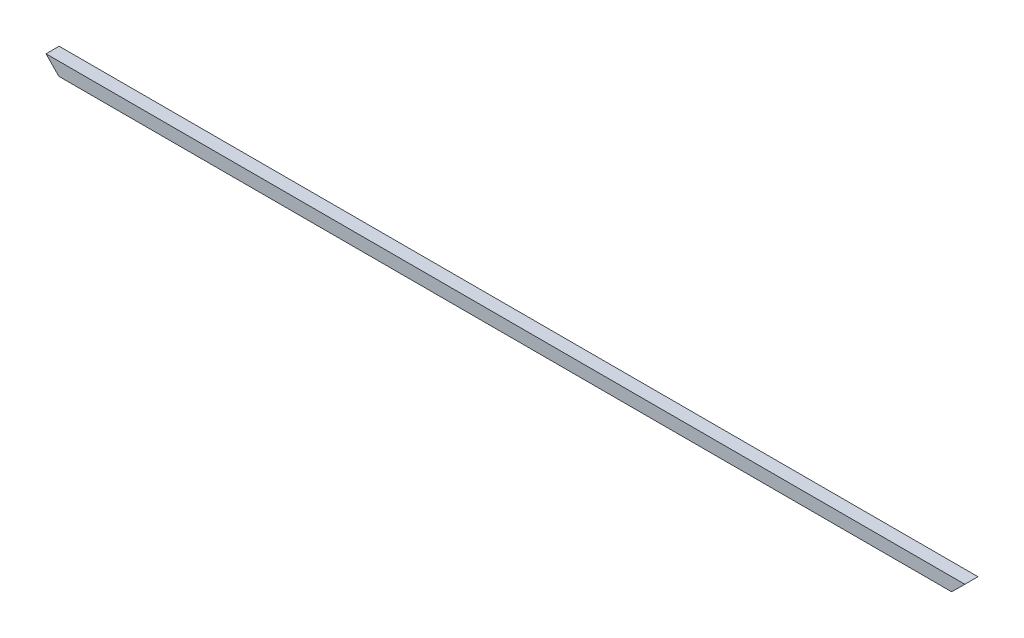
ISO-10303-21;
HEADER;
FILE_DESCRIPTION(('STEP AP214'),'2;1');
FILE_NAME('part.step','',(''),(''),'','','');
FILE_SCHEMA(('AUTOMOTIVE_DESIGN { 1 0 10303 214 1 1 1 1 }'));
ENDSEC;
DATA;
#1=APPLICATION_CONTEXT('core data for automotive mechanical design processes');
#2=APPLICATION_PROTOCOL_DEFINITION('international standard','automotive_design',2000,#1);
#3=PRODUCT_CONTEXT('',#1,'mechanical');
#4=PRODUCT('Part','Part','',(#3));
#5=PRODUCT_RELATED_PRODUCT_CATEGORY('part','',(#4));
#6=PRODUCT_DEFINITION_FORMATION('','',#4);
#7=PRODUCT_DEFINITION_CONTEXT('part definition',#1,'design');
#8=PRODUCT_DEFINITION('design','',#6,#7);
#9=PRODUCT_DEFINITION_SHAPE('','',#8);
#10=(LENGTH_UNIT() NAMED_UNIT(*) SI_UNIT(.MILLI.,.METRE.));
#11=(NAMED_UNIT(*) PLANE_ANGLE_UNIT() SI_UNIT($,.RADIAN.));
#12=(NAMED_UNIT(*) SI_UNIT($,.STERADIAN.) SOLID_ANGLE_UNIT());
#13=UNCERTAINTY_MEASURE_WITH_UNIT(LENGTH_MEASURE(1.E-05),#10,'distance_accuracy_value','');
#14=(GEOMETRIC_REPRESENTATION_CONTEXT(3) GLOBAL_UNCERTAINTY_ASSIGNED_CONTEXT((#13)) GLOBAL_UNIT_ASSIGNED_CONTEXT((#10,
#11,#12)) REPRESENTATION_CONTEXT('',''));
#15=CARTESIAN_POINT('',(0.,0.,0.));
#16=DIRECTION('',(0.,0.,1.));
#17=DIRECTION('',(1.,0.,0.));
#18=AXIS2_PLACEMENT_3D('',#15,#16,#17);
#19=CARTESIAN_POINT('',(-2737.42510763321,-40.0000000000003,40.));
#20=DIRECTION('',(0.713984048401931,0.700161965996147,0.));
#21=DIRECTION('',(-0.700161965996147,0.713984048401931,0.));
#22=AXIS2_PLACEMENT_3D('',#19,#20,#21);
#23=PLANE('',#22);
#24=DIRECTION('',(0.700161965996147,-0.713984048401931,0.));
#25=VECTOR('',#24,1.);
#26=CARTESIAN_POINT('',(-2737.42510763321,-40.0000000000003,0.));
#27=LINE('',#26,#25);
#28=CARTESIAN_POINT('',(-2776.65074397976,0.,0.));
#29=VERTEX_POINT('',#28);
#30=CARTESIAN_POINT('',(-2737.42510763321,-40.0000000000003,0.));
#31=VERTEX_POINT('',#30);
#32=EDGE_CURVE('E97',#29,#31,#27,.T.);
#33=ORIENTED_EDGE('',*,*,#32,.T.);
#34=DIRECTION('',(0.,0.,-1.));
#35=VECTOR('',#34,1.);
#36=CARTESIAN_POINT('',(-2737.42510763321,-40.0000000000003,40.));
#37=LINE('',#36,#35);
#38=CARTESIAN_POINT('',(-2737.42510763321,-40.0000000000003,40.));
#39=VERTEX_POINT('',#38);
#40=EDGE_CURVE('E11',#39,#31,#37,.T.);
#41=ORIENTED_EDGE('',*,*,#40,.F.);
#42=DIRECTION('',(0.700161965996147,-0.713984048401931,0.));
#43=VECTOR('',#42,1.);
#44=CARTESIAN_POINT('',(-2737.42510763321,-40.0000000000003,40.));
#45=LINE('',#44,#43);
#46=CARTESIAN_POINT('',(-2776.65074397976,0.,40.));
#47=VERTEX_POINT('',#46);
#48=EDGE_CURVE('E85',#47,#39,#45,.T.);
#49=ORIENTED_EDGE('',*,*,#48,.F.);
#50=DIRECTION('',(0.,0.,-1.));
#51=VECTOR('',#50,1.);
#52=CARTESIAN_POINT('',(-2776.65074397976,0.,40.));
#53=LINE('',#52,#51);
#54=EDGE_CURVE('E93',#47,#29,#53,.T.);
#55=ORIENTED_EDGE('',*,*,#54,.T.);
#56=EDGE_LOOP('',(#33,#41,#49,#55));
#57=FACE_BOUND('',#56,.T.);
#58=ADVANCED_FACE('F34',(#57),#23,.F.);
#59=CARTESIAN_POINT('',(-16.7718316582911,-40.,40.));
#60=DIRECTION('',(0.,1.,0.));
#61=DIRECTION('',(-1.,0.,0.));
#62=AXIS2_PLACEMENT_3D('',#59,#60,#61);
#63=PLANE('',#62);
#64=DIRECTION('',(1.,0.,0.));
#65=VECTOR('',#64,1.);
#66=CARTESIAN_POINT('',(-16.7718316582911,-40.,0.));
#67=LINE('',#66,#65);
#68=CARTESIAN_POINT('',(-16.7718316582911,-40.,0.));
#69=VERTEX_POINT('',#68);
#70=EDGE_CURVE('E89',#31,#69,#67,.T.);
#71=ORIENTED_EDGE('',*,*,#70,.T.);
#72=DIRECTION('',(0.,0.,-1.));
#73=VECTOR('',#72,1.);
#74=CARTESIAN_POINT('',(-16.7718316582911,-40.,40.));
#75=LINE('',#74,#73);
#76=CARTESIAN_POINT('',(-16.7718316582911,-40.,40.));
#77=VERTEX_POINT('',#76);
#78=EDGE_CURVE('E42',#77,#69,#75,.T.);
#79=ORIENTED_EDGE('',*,*,#78,.F.);
#80=DIRECTION('',(1.,0.,0.));
#81=VECTOR('',#80,1.);
#82=CARTESIAN_POINT('',(-16.7718316582911,-40.,40.));
#83=LINE('',#82,#81);
#84=EDGE_CURVE('E80',#39,#77,#83,.T.);
#85=ORIENTED_EDGE('',*,*,#84,.F.);
#86=ORIENTED_EDGE('',*,*,#40,.T.);
#87=EDGE_LOOP('',(#71,#79,#85,#86));
#88=FACE_BOUND('',#87,.T.);
#89=ADVANCED_FACE('F88',(#88),#63,.F.);
#90=CARTESIAN_POINT('',(23.6492560202433,0.,40.));
#91=DIRECTION('',(-0.7033947028105,0.710799473872996,0.));
#92=DIRECTION('',(-0.710799473872996,-0.7033947028105,0.));
#93=AXIS2_PLACEMENT_3D('',#90,#91,#92);
#94=PLANE('',#93);
#95=DIRECTION('',(0.710799473872996,0.7033947028105,0.));
#96=VECTOR('',#95,1.);
#97=CARTESIAN_POINT('',(23.6492560202433,0.,0.));
#98=LINE('',#97,#96);
#99=CARTESIAN_POINT('',(23.6492560202433,0.,0.));
#100=VERTEX_POINT('',#99);
#101=EDGE_CURVE('E67',#69,#100,#98,.T.);
#102=ORIENTED_EDGE('',*,*,#101,.T.);
#103=DIRECTION('',(0.,0.,-1.));
#104=VECTOR('',#103,1.);
#105=CARTESIAN_POINT('',(23.6492560202433,0.,40.));
#106=LINE('',#105,#104);
#107=CARTESIAN_POINT('',(23.6492560202433,0.,40.));
#108=VERTEX_POINT('',#107);
#109=EDGE_CURVE('E90',#108,#100,#106,.T.);
#110=ORIENTED_EDGE('',*,*,#109,.F.);
#111=DIRECTION('',(0.710799473872996,0.7033947028105,0.));
#112=VECTOR('',#111,1.);
#113=CARTESIAN_POINT('',(23.6492560202433,0.,40.));
#114=LINE('',#113,#112);
#115=EDGE_CURVE('E83',#77,#108,#114,.T.);
#116=ORIENTED_EDGE('',*,*,#115,.F.);
#117=ORIENTED_EDGE('',*,*,#78,.T.);
#118=EDGE_LOOP('',(#102,#110,#116,#117));
#119=FACE_BOUND('',#118,.T.);
#120=ADVANCED_FACE('F91',(#119),#94,.F.);
#121=CARTESIAN_POINT('',(-2776.65074397976,0.,40.));
#122=DIRECTION('',(0.,-1.,0.));
#123=DIRECTION('',(0.,0.,-1.));
#124=AXIS2_PLACEMENT_3D('',#121,#122,#123);
#125=PLANE('',#124);
#126=DIRECTION('',(-1.,0.,0.));
#127=VECTOR('',#126,1.);
#128=CARTESIAN_POINT('',(-2776.65074397976,0.,0.));
#129=LINE('',#128,#127);
#130=EDGE_CURVE('E73',#100,#29,#129,.T.);
#131=ORIENTED_EDGE('',*,*,#130,.T.);
#132=ORIENTED_EDGE('',*,*,#54,.F.);
#133=DIRECTION('',(-1.,0.,0.));
#134=VECTOR('',#133,1.);
#135=CARTESIAN_POINT('',(-2776.65074397976,0.,40.));
#136=LINE('',#135,#134);
#137=EDGE_CURVE('E50',#108,#47,#136,.T.);
#138=ORIENTED_EDGE('',*,*,#137,.F.);
#139=ORIENTED_EDGE('',*,*,#109,.T.);
#140=EDGE_LOOP('',(#131,#132,#138,#139));
#141=FACE_BOUND('',#140,.T.);
#142=ADVANCED_FACE('F104',(#141),#125,.F.);
#143=CARTESIAN_POINT('',(0.,0.,40.));
#144=DIRECTION('',(0.,0.,1.));
#145=DIRECTION('',(1.,0.,0.));
#146=AXIS2_PLACEMENT_3D('',#143,#144,#145);
#147=PLANE('',#146);
#148=ORIENTED_EDGE('',*,*,#48,.T.);
#149=ORIENTED_EDGE('',*,*,#84,.T.);
#150=ORIENTED_EDGE('',*,*,#115,.T.);
#151=ORIENTED_EDGE('',*,*,#137,.T.);
#152=EDGE_LOOP('',(#148,#149,#150,#151));
#153=FACE_BOUND('',#152,.T.);
#154=ADVANCED_FACE('F81',(#153),#147,.T.);
#155=CARTESIAN_POINT('',(0.,0.,0.));
#156=DIRECTION('',(0.,0.,1.));
#157=DIRECTION('',(1.,0.,0.));
#158=AXIS2_PLACEMENT_3D('',#155,#156,#157);
#159=PLANE('',#158);
#160=ORIENTED_EDGE('',*,*,#32,.F.);
#161=ORIENTED_EDGE('',*,*,#130,.F.);
#162=ORIENTED_EDGE('',*,*,#101,.F.);
#163=ORIENTED_EDGE('',*,*,#70,.F.);
#164=EDGE_LOOP('',(#160,#161,#162,#163));
#165=FACE_BOUND('',#164,.T.);
#166=ADVANCED_FACE('F107',(#165),#159,.F.);
#167=CLOSED_SHELL('',(#58,#89,#120,#142,#154,#166));
#168=MANIFOLD_SOLID_BREP('B2',#167);
#169=ADVANCED_BREP_SHAPE_REPRESENTATION('',(#18,#168),#14);
#170=SHAPE_DEFINITION_REPRESENTATION(#9,#169);
ENDSEC;
END-ISO-10303-21;
